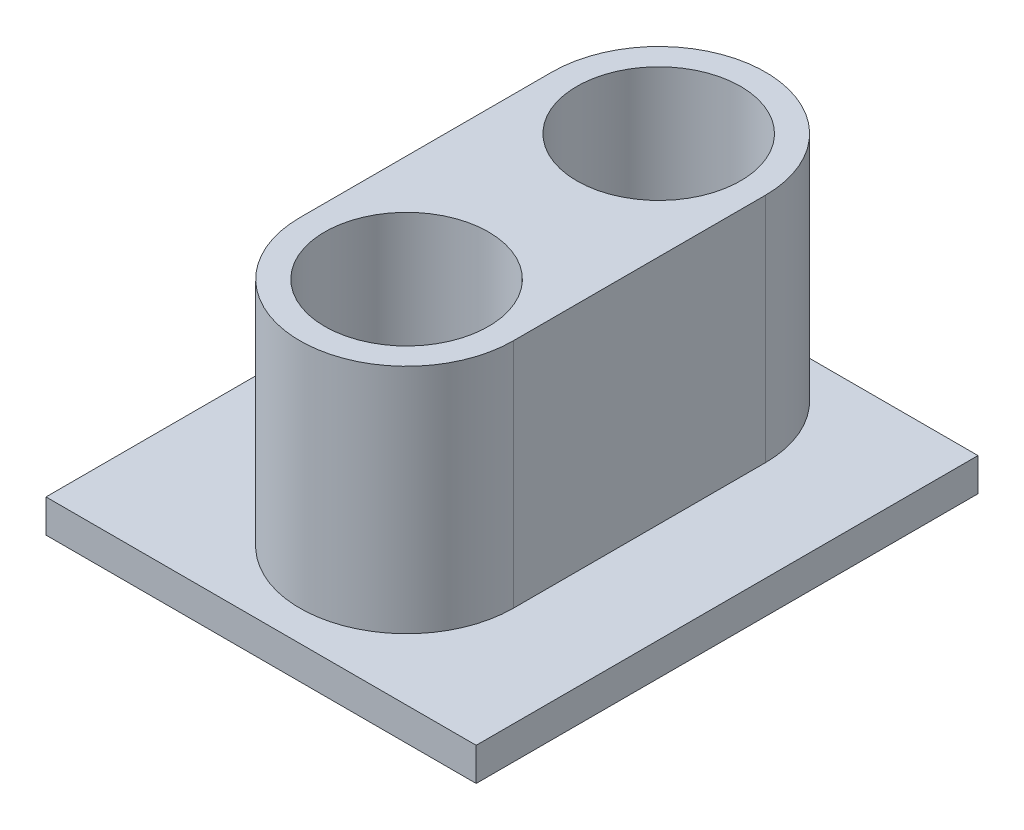
ISO-10303-21;
HEADER;
FILE_DESCRIPTION(('STEP AP214'),'2;1');
FILE_NAME('part.step','',(''),(''),'','','');
FILE_SCHEMA(('AUTOMOTIVE_DESIGN { 1 0 10303 214 1 1 1 1 }'));
ENDSEC;
DATA;
#1=APPLICATION_CONTEXT('core data for automotive mechanical design processes');
#2=APPLICATION_PROTOCOL_DEFINITION('international standard','automotive_design',2000,#1);
#3=PRODUCT_CONTEXT('',#1,'mechanical');
#4=PRODUCT('Part','Part','',(#3));
#5=PRODUCT_RELATED_PRODUCT_CATEGORY('part','',(#4));
#6=PRODUCT_DEFINITION_FORMATION('','',#4);
#7=PRODUCT_DEFINITION_CONTEXT('part definition',#1,'design');
#8=PRODUCT_DEFINITION('design','',#6,#7);
#9=PRODUCT_DEFINITION_SHAPE('','',#8);
#10=(LENGTH_UNIT() NAMED_UNIT(*) SI_UNIT(.MILLI.,.METRE.));
#11=(NAMED_UNIT(*) PLANE_ANGLE_UNIT() SI_UNIT($,.RADIAN.));
#12=(NAMED_UNIT(*) SI_UNIT($,.STERADIAN.) SOLID_ANGLE_UNIT());
#13=UNCERTAINTY_MEASURE_WITH_UNIT(LENGTH_MEASURE(1.E-05),#10,'distance_accuracy_value','');
#14=(GEOMETRIC_REPRESENTATION_CONTEXT(3) GLOBAL_UNCERTAINTY_ASSIGNED_CONTEXT((#13)) GLOBAL_UNIT_ASSIGNED_CONTEXT((#10,
#11,#12)) REPRESENTATION_CONTEXT('',''));
#15=CARTESIAN_POINT('',(0.,0.,0.));
#16=DIRECTION('',(0.,0.,1.));
#17=DIRECTION('',(1.,0.,0.));
#18=AXIS2_PLACEMENT_3D('',#15,#16,#17);
#19=CARTESIAN_POINT('',(0.,2.,0.));
#20=DIRECTION('',(0.,-1.,0.));
#21=DIRECTION('',(0.,0.,-1.));
#22=AXIS2_PLACEMENT_3D('',#19,#20,#21);
#23=PLANE('',#22);
#24=DIRECTION('',(0.,0.,1.));
#25=VECTOR('',#24,1.);
#26=CARTESIAN_POINT('',(-13.,2.,15.165));
#27=LINE('',#26,#25);
#28=CARTESIAN_POINT('',(-13.,2.,-15.165));
#29=VERTEX_POINT('',#28);
#30=CARTESIAN_POINT('',(-13.,2.,15.165));
#31=VERTEX_POINT('',#30);
#32=EDGE_CURVE('E139',#29,#31,#27,.T.);
#33=ORIENTED_EDGE('',*,*,#32,.T.);
#34=DIRECTION('',(1.,0.,0.));
#35=VECTOR('',#34,1.);
#36=CARTESIAN_POINT('',(-13.,2.,15.165));
#37=LINE('',#36,#35);
#38=CARTESIAN_POINT('',(13.,2.,15.165));
#39=VERTEX_POINT('',#38);
#40=EDGE_CURVE('E142',#31,#39,#37,.T.);
#41=ORIENTED_EDGE('',*,*,#40,.T.);
#42=DIRECTION('',(0.,0.,-1.));
#43=VECTOR('',#42,1.);
#44=CARTESIAN_POINT('',(13.,2.,15.165));
#45=LINE('',#44,#43);
#46=CARTESIAN_POINT('',(13.,2.,-15.165));
#47=VERTEX_POINT('',#46);
#48=EDGE_CURVE('E145',#39,#47,#45,.T.);
#49=ORIENTED_EDGE('',*,*,#48,.T.);
#50=DIRECTION('',(-1.,0.,0.));
#51=VECTOR('',#50,1.);
#52=CARTESIAN_POINT('',(-13.,2.,-15.165));
#53=LINE('',#52,#51);
#54=EDGE_CURVE('E147',#47,#29,#53,.T.);
#55=ORIENTED_EDGE('',*,*,#54,.T.);
#56=EDGE_LOOP('',(#33,#41,#49,#55));
#57=FACE_BOUND('',#56,.T.);
#58=CARTESIAN_POINT('',(0.499999999999994,2.,6.87000086467314));
#59=DIRECTION('',(0.,1.,0.));
#60=DIRECTION('',(0.,0.,1.));
#61=AXIS2_PLACEMENT_3D('',#58,#59,#60);
#62=CIRCLE('',#61,6.45000000000002);
#63=CARTESIAN_POINT('',(-5.95000000000003,2.,6.87000086467314));
#64=VERTEX_POINT('',#63);
#65=CARTESIAN_POINT('',(6.95000000000002,2.,6.87000086467314));
#66=VERTEX_POINT('',#65);
#67=EDGE_CURVE('E56',#64,#66,#62,.T.);
#68=ORIENTED_EDGE('',*,*,#67,.F.);
#69=DIRECTION('',(0.,0.,1.));
#70=VECTOR('',#69,1.);
#71=CARTESIAN_POINT('',(-5.95000000000003,2.,6.87000086467314));
#72=LINE('',#71,#70);
#73=CARTESIAN_POINT('',(-5.95000000000002,2.,-8.36704031638036));
#74=VERTEX_POINT('',#73);
#75=EDGE_CURVE('E60',#74,#64,#72,.T.);
#76=ORIENTED_EDGE('',*,*,#75,.F.);
#77=CARTESIAN_POINT('',(0.500000000000001,2.,-8.36704031638036));
#78=DIRECTION('',(0.,1.,0.));
#79=DIRECTION('',(0.,0.,1.));
#80=AXIS2_PLACEMENT_3D('',#77,#78,#79);
#81=CIRCLE('',#80,6.45000000000002);
#82=CARTESIAN_POINT('',(6.95000000000002,2.,-8.36704031638036));
#83=VERTEX_POINT('',#82);
#84=EDGE_CURVE('E288',#83,#74,#81,.T.);
#85=ORIENTED_EDGE('',*,*,#84,.F.);
#86=DIRECTION('',(0.,0.,-1.));
#87=VECTOR('',#86,1.);
#88=CARTESIAN_POINT('',(6.95000000000002,2.,6.87000086467314));
#89=LINE('',#88,#87);
#90=EDGE_CURVE('E294',#66,#83,#89,.T.);
#91=ORIENTED_EDGE('',*,*,#90,.F.);
#92=EDGE_LOOP('',(#68,#76,#85,#91));
#93=FACE_BOUND('',#92,.T.);
#94=ADVANCED_FACE('F41',(#57,#93),#23,.F.);
#95=CARTESIAN_POINT('',(-13.,2.,15.165));
#96=DIRECTION('',(1.,0.,0.));
#97=DIRECTION('',(0.,0.,-1.));
#98=AXIS2_PLACEMENT_3D('',#95,#96,#97);
#99=PLANE('',#98);
#100=DIRECTION('',(0.,0.,1.));
#101=VECTOR('',#100,1.);
#102=CARTESIAN_POINT('',(-13.,0.,15.165));
#103=LINE('',#102,#101);
#104=CARTESIAN_POINT('',(-13.,0.,-15.165));
#105=VERTEX_POINT('',#104);
#106=CARTESIAN_POINT('',(-13.,0.,15.165));
#107=VERTEX_POINT('',#106);
#108=EDGE_CURVE('E137',#105,#107,#103,.T.);
#109=ORIENTED_EDGE('',*,*,#108,.T.);
#110=DIRECTION('',(0.,-1.,0.));
#111=VECTOR('',#110,1.);
#112=CARTESIAN_POINT('',(-13.,2.,15.165));
#113=LINE('',#112,#111);
#114=EDGE_CURVE('E11',#31,#107,#113,.T.);
#115=ORIENTED_EDGE('',*,*,#114,.F.);
#116=ORIENTED_EDGE('',*,*,#32,.F.);
#117=DIRECTION('',(0.,-1.,0.));
#118=VECTOR('',#117,1.);
#119=CARTESIAN_POINT('',(-13.,2.,-15.165));
#120=LINE('',#119,#118);
#121=EDGE_CURVE('E149',#29,#105,#120,.T.);
#122=ORIENTED_EDGE('',*,*,#121,.T.);
#123=EDGE_LOOP('',(#109,#115,#116,#122));
#124=FACE_BOUND('',#123,.T.);
#125=ADVANCED_FACE('F43',(#124),#99,.F.);
#126=CARTESIAN_POINT('',(-13.,2.,15.165));
#127=DIRECTION('',(0.,0.,-1.));
#128=DIRECTION('',(-1.,0.,0.));
#129=AXIS2_PLACEMENT_3D('',#126,#127,#128);
#130=PLANE('',#129);
#131=DIRECTION('',(1.,0.,0.));
#132=VECTOR('',#131,1.);
#133=CARTESIAN_POINT('',(-13.,0.,15.165));
#134=LINE('',#133,#132);
#135=CARTESIAN_POINT('',(13.,0.,15.165));
#136=VERTEX_POINT('',#135);
#137=EDGE_CURVE('E152',#107,#136,#134,.T.);
#138=ORIENTED_EDGE('',*,*,#137,.T.);
#139=DIRECTION('',(0.,-1.,0.));
#140=VECTOR('',#139,1.);
#141=CARTESIAN_POINT('',(13.,2.,15.165));
#142=LINE('',#141,#140);
#143=EDGE_CURVE('E49',#39,#136,#142,.T.);
#144=ORIENTED_EDGE('',*,*,#143,.F.);
#145=ORIENTED_EDGE('',*,*,#40,.F.);
#146=ORIENTED_EDGE('',*,*,#114,.T.);
#147=EDGE_LOOP('',(#138,#144,#145,#146));
#148=FACE_BOUND('',#147,.T.);
#149=ADVANCED_FACE('F181',(#148),#130,.F.);
#150=CARTESIAN_POINT('',(13.,2.,15.165));
#151=DIRECTION('',(-1.,0.,0.));
#152=DIRECTION('',(0.,0.,1.));
#153=AXIS2_PLACEMENT_3D('',#150,#151,#152);
#154=PLANE('',#153);
#155=DIRECTION('',(0.,0.,-1.));
#156=VECTOR('',#155,1.);
#157=CARTESIAN_POINT('',(13.,0.,15.165));
#158=LINE('',#157,#156);
#159=CARTESIAN_POINT('',(13.,0.,-15.165));
#160=VERTEX_POINT('',#159);
#161=EDGE_CURVE('E154',#136,#160,#158,.T.);
#162=ORIENTED_EDGE('',*,*,#161,.T.);
#163=DIRECTION('',(0.,-1.,0.));
#164=VECTOR('',#163,1.);
#165=CARTESIAN_POINT('',(13.,2.,-15.165));
#166=LINE('',#165,#164);
#167=EDGE_CURVE('E159',#47,#160,#166,.T.);
#168=ORIENTED_EDGE('',*,*,#167,.F.);
#169=ORIENTED_EDGE('',*,*,#48,.F.);
#170=ORIENTED_EDGE('',*,*,#143,.T.);
#171=EDGE_LOOP('',(#162,#168,#169,#170));
#172=FACE_BOUND('',#171,.T.);
#173=ADVANCED_FACE('F166',(#172),#154,.F.);
#174=CARTESIAN_POINT('',(-13.,2.,-15.165));
#175=DIRECTION('',(0.,0.,1.));
#176=DIRECTION('',(1.,0.,0.));
#177=AXIS2_PLACEMENT_3D('',#174,#175,#176);
#178=PLANE('',#177);
#179=DIRECTION('',(-1.,0.,0.));
#180=VECTOR('',#179,1.);
#181=CARTESIAN_POINT('',(-13.,0.,-15.165));
#182=LINE('',#181,#180);
#183=EDGE_CURVE('E143',#160,#105,#182,.T.);
#184=ORIENTED_EDGE('',*,*,#183,.T.);
#185=ORIENTED_EDGE('',*,*,#121,.F.);
#186=ORIENTED_EDGE('',*,*,#54,.F.);
#187=ORIENTED_EDGE('',*,*,#167,.T.);
#188=EDGE_LOOP('',(#184,#185,#186,#187));
#189=FACE_BOUND('',#188,.T.);
#190=ADVANCED_FACE('F175',(#189),#178,.F.);
#191=CARTESIAN_POINT('',(0.,0.,0.));
#192=DIRECTION('',(0.,-1.,0.));
#193=DIRECTION('',(0.,0.,-1.));
#194=AXIS2_PLACEMENT_3D('',#191,#192,#193);
#195=PLANE('',#194);
#196=CARTESIAN_POINT('',(0.500000000000002,0.,6.87000086467312));
#197=DIRECTION('',(0.,1.,0.));
#198=DIRECTION('',(0.,0.,1.));
#199=AXIS2_PLACEMENT_3D('',#196,#197,#198);
#200=CIRCLE('',#199,4.95000000000002);
#201=CARTESIAN_POINT('',(0.500000000000002,0.,11.8200008646731));
#202=VERTEX_POINT('',#201);
#203=EDGE_CURVE('E130',#202,#202,#200,.T.);
#204=ORIENTED_EDGE('',*,*,#203,.T.);
#205=EDGE_LOOP('',(#204));
#206=FACE_BOUND('',#205,.T.);
#207=CARTESIAN_POINT('',(0.500000000000001,0.,-8.36704031638036));
#208=DIRECTION('',(0.,1.,0.));
#209=DIRECTION('',(0.,0.,1.));
#210=AXIS2_PLACEMENT_3D('',#207,#208,#209);
#211=CIRCLE('',#210,4.95000000000002);
#212=CARTESIAN_POINT('',(0.500000000000001,0.,-3.41704031638035));
#213=VERTEX_POINT('',#212);
#214=EDGE_CURVE('E127',#213,#213,#211,.T.);
#215=ORIENTED_EDGE('',*,*,#214,.T.);
#216=EDGE_LOOP('',(#215));
#217=FACE_BOUND('',#216,.T.);
#218=ORIENTED_EDGE('',*,*,#108,.F.);
#219=ORIENTED_EDGE('',*,*,#183,.F.);
#220=ORIENTED_EDGE('',*,*,#161,.F.);
#221=ORIENTED_EDGE('',*,*,#137,.F.);
#222=EDGE_LOOP('',(#218,#219,#220,#221));
#223=FACE_BOUND('',#222,.T.);
#224=ADVANCED_FACE('F172',(#206,#217,#223),#195,.T.);
#225=CARTESIAN_POINT('',(0.500000000000001,0.,-8.36704031638036));
#226=DIRECTION('',(0.,1.,0.));
#227=DIRECTION('',(0.,0.,1.));
#228=AXIS2_PLACEMENT_3D('',#225,#226,#227);
#229=CYLINDRICAL_SURFACE('',#228,4.95000000000002);
#230=ORIENTED_EDGE('',*,*,#214,.F.);
#231=EDGE_LOOP('',(#230));
#232=FACE_BOUND('',#231,.T.);
#233=CARTESIAN_POINT('',(0.500000000000001,16.,-8.36704031638036));
#234=DIRECTION('',(0.,1.,0.));
#235=DIRECTION('',(0.,0.,1.));
#236=AXIS2_PLACEMENT_3D('',#233,#234,#235);
#237=CIRCLE('',#236,4.95000000000002);
#238=CARTESIAN_POINT('',(0.500000000000001,16.,-3.41704031638035));
#239=VERTEX_POINT('',#238);
#240=EDGE_CURVE('E301',#239,#239,#237,.T.);
#241=ORIENTED_EDGE('',*,*,#240,.T.);
#242=EDGE_LOOP('',(#241));
#243=FACE_BOUND('',#242,.T.);
#244=ADVANCED_FACE('F196',(#232,#243),#229,.F.);
#245=CARTESIAN_POINT('',(0.500000000000002,0.,6.87000086467312));
#246=DIRECTION('',(0.,1.,0.));
#247=DIRECTION('',(0.,0.,1.));
#248=AXIS2_PLACEMENT_3D('',#245,#246,#247);
#249=CYLINDRICAL_SURFACE('',#248,4.95000000000002);
#250=ORIENTED_EDGE('',*,*,#203,.F.);
#251=EDGE_LOOP('',(#250));
#252=FACE_BOUND('',#251,.T.);
#253=CARTESIAN_POINT('',(0.499999999999994,16.,6.87000086467314));
#254=DIRECTION('',(0.,1.,0.));
#255=DIRECTION('',(0.,0.,1.));
#256=AXIS2_PLACEMENT_3D('',#253,#254,#255);
#257=CIRCLE('',#256,4.95000000000002);
#258=CARTESIAN_POINT('',(0.499999999999994,16.,11.8200008646732));
#259=VERTEX_POINT('',#258);
#260=EDGE_CURVE('E296',#259,#259,#257,.T.);
#261=ORIENTED_EDGE('',*,*,#260,.T.);
#262=EDGE_LOOP('',(#261));
#263=FACE_BOUND('',#262,.T.);
#264=ADVANCED_FACE('F220',(#252,#263),#249,.F.);
#265=CARTESIAN_POINT('',(0.499999999999994,16.,6.87000086467314));
#266=DIRECTION('',(0.,1.,0.));
#267=DIRECTION('',(0.,0.,1.));
#268=AXIS2_PLACEMENT_3D('',#265,#266,#267);
#269=PLANE('',#268);
#270=ORIENTED_EDGE('',*,*,#260,.F.);
#271=EDGE_LOOP('',(#270));
#272=FACE_BOUND('',#271,.T.);
#273=CARTESIAN_POINT('',(0.499999999999994,16.,6.87000086467314));
#274=DIRECTION('',(0.,1.,0.));
#275=DIRECTION('',(0.,0.,1.));
#276=AXIS2_PLACEMENT_3D('',#273,#274,#275);
#277=CIRCLE('',#276,6.45000000000002);
#278=CARTESIAN_POINT('',(-5.95000000000003,16.,6.87000086467314));
#279=VERTEX_POINT('',#278);
#280=CARTESIAN_POINT('',(6.95000000000002,16.,6.87000086467314));
#281=VERTEX_POINT('',#280);
#282=EDGE_CURVE('E115',#279,#281,#277,.T.);
#283=ORIENTED_EDGE('',*,*,#282,.T.);
#284=DIRECTION('',(0.,0.,-1.));
#285=VECTOR('',#284,1.);
#286=CARTESIAN_POINT('',(6.95000000000002,16.,6.87000086467314));
#287=LINE('',#286,#285);
#288=CARTESIAN_POINT('',(6.95000000000002,16.,-8.36704031638036));
#289=VERTEX_POINT('',#288);
#290=EDGE_CURVE('E104',#281,#289,#287,.T.);
#291=ORIENTED_EDGE('',*,*,#290,.T.);
#292=CARTESIAN_POINT('',(0.500000000000001,16.,-8.36704031638036));
#293=DIRECTION('',(0.,1.,0.));
#294=DIRECTION('',(0.,0.,1.));
#295=AXIS2_PLACEMENT_3D('',#292,#293,#294);
#296=CIRCLE('',#295,6.45000000000002);
#297=CARTESIAN_POINT('',(-5.95000000000002,16.,-8.36704031638036));
#298=VERTEX_POINT('',#297);
#299=EDGE_CURVE('E114',#289,#298,#296,.T.);
#300=ORIENTED_EDGE('',*,*,#299,.T.);
#301=DIRECTION('',(0.,0.,1.));
#302=VECTOR('',#301,1.);
#303=CARTESIAN_POINT('',(-5.95000000000003,16.,6.87000086467314));
#304=LINE('',#303,#302);
#305=EDGE_CURVE('E121',#298,#279,#304,.T.);
#306=ORIENTED_EDGE('',*,*,#305,.T.);
#307=EDGE_LOOP('',(#283,#291,#300,#306));
#308=FACE_BOUND('',#307,.T.);
#309=ORIENTED_EDGE('',*,*,#240,.F.);
#310=EDGE_LOOP('',(#309));
#311=FACE_BOUND('',#310,.T.);
#312=ADVANCED_FACE('F118',(#272,#308,#311),#269,.T.);
#313=CARTESIAN_POINT('',(0.499999999999994,16.,6.87000086467314));
#314=DIRECTION('',(0.,-1.,0.));
#315=DIRECTION('',(0.,0.,-1.));
#316=AXIS2_PLACEMENT_3D('',#313,#314,#315);
#317=CYLINDRICAL_SURFACE('',#316,6.45000000000002);
#318=ORIENTED_EDGE('',*,*,#67,.T.);
#319=DIRECTION('',(0.,-1.,0.));
#320=VECTOR('',#319,1.);
#321=CARTESIAN_POINT('',(6.95000000000002,16.,6.87000086467314));
#322=LINE('',#321,#320);
#323=EDGE_CURVE('E109',#281,#66,#322,.T.);
#324=ORIENTED_EDGE('',*,*,#323,.F.);
#325=ORIENTED_EDGE('',*,*,#282,.F.);
#326=DIRECTION('',(0.,-1.,0.));
#327=VECTOR('',#326,1.);
#328=CARTESIAN_POINT('',(-5.95000000000003,16.,6.87000086467314));
#329=LINE('',#328,#327);
#330=EDGE_CURVE('E286',#279,#64,#329,.T.);
#331=ORIENTED_EDGE('',*,*,#330,.T.);
#332=EDGE_LOOP('',(#318,#324,#325,#331));
#333=FACE_BOUND('',#332,.T.);
#334=ADVANCED_FACE('F126',(#333),#317,.T.);
#335=CARTESIAN_POINT('',(6.95000000000002,16.,6.87000086467314));
#336=DIRECTION('',(-1.,0.,0.));
#337=DIRECTION('',(0.,0.,1.));
#338=AXIS2_PLACEMENT_3D('',#335,#336,#337);
#339=PLANE('',#338);
#340=ORIENTED_EDGE('',*,*,#90,.T.);
#341=DIRECTION('',(0.,-1.,0.));
#342=VECTOR('',#341,1.);
#343=CARTESIAN_POINT('',(6.95000000000002,16.,-8.36704031638036));
#344=LINE('',#343,#342);
#345=EDGE_CURVE('E111',#289,#83,#344,.T.);
#346=ORIENTED_EDGE('',*,*,#345,.F.);
#347=ORIENTED_EDGE('',*,*,#290,.F.);
#348=ORIENTED_EDGE('',*,*,#323,.T.);
#349=EDGE_LOOP('',(#340,#346,#347,#348));
#350=FACE_BOUND('',#349,.T.);
#351=ADVANCED_FACE('F107',(#350),#339,.F.);
#352=CARTESIAN_POINT('',(0.500000000000001,16.,-8.36704031638036));
#353=DIRECTION('',(0.,-1.,0.));
#354=DIRECTION('',(0.,0.,-1.));
#355=AXIS2_PLACEMENT_3D('',#352,#353,#354);
#356=CYLINDRICAL_SURFACE('',#355,6.45000000000002);
#357=ORIENTED_EDGE('',*,*,#84,.T.);
#358=DIRECTION('',(0.,-1.,0.));
#359=VECTOR('',#358,1.);
#360=CARTESIAN_POINT('',(-5.95000000000002,16.,-8.36704031638036));
#361=LINE('',#360,#359);
#362=EDGE_CURVE('E132',#298,#74,#361,.T.);
#363=ORIENTED_EDGE('',*,*,#362,.F.);
#364=ORIENTED_EDGE('',*,*,#299,.F.);
#365=ORIENTED_EDGE('',*,*,#345,.T.);
#366=EDGE_LOOP('',(#357,#363,#364,#365));
#367=FACE_BOUND('',#366,.T.);
#368=ADVANCED_FACE('F258',(#367),#356,.T.);
#369=CARTESIAN_POINT('',(-5.95000000000003,16.,6.87000086467314));
#370=DIRECTION('',(1.,0.,0.));
#371=DIRECTION('',(0.,0.,-1.));
#372=AXIS2_PLACEMENT_3D('',#369,#370,#371);
#373=PLANE('',#372);
#374=ORIENTED_EDGE('',*,*,#75,.T.);
#375=ORIENTED_EDGE('',*,*,#330,.F.);
#376=ORIENTED_EDGE('',*,*,#305,.F.);
#377=ORIENTED_EDGE('',*,*,#362,.T.);
#378=EDGE_LOOP('',(#374,#375,#376,#377));
#379=FACE_BOUND('',#378,.T.);
#380=ADVANCED_FACE('F266',(#379),#373,.F.);
#381=CLOSED_SHELL('',(#94,#125,#149,#173,#190,#224,#244,#264,#312,#334,#351,#368,#380));
#382=MANIFOLD_SOLID_BREP('B2',#381);
#383=ADVANCED_BREP_SHAPE_REPRESENTATION('',(#18,#382),#14);
#384=SHAPE_DEFINITION_REPRESENTATION(#9,#383);
ENDSEC;
END-ISO-10303-21;
